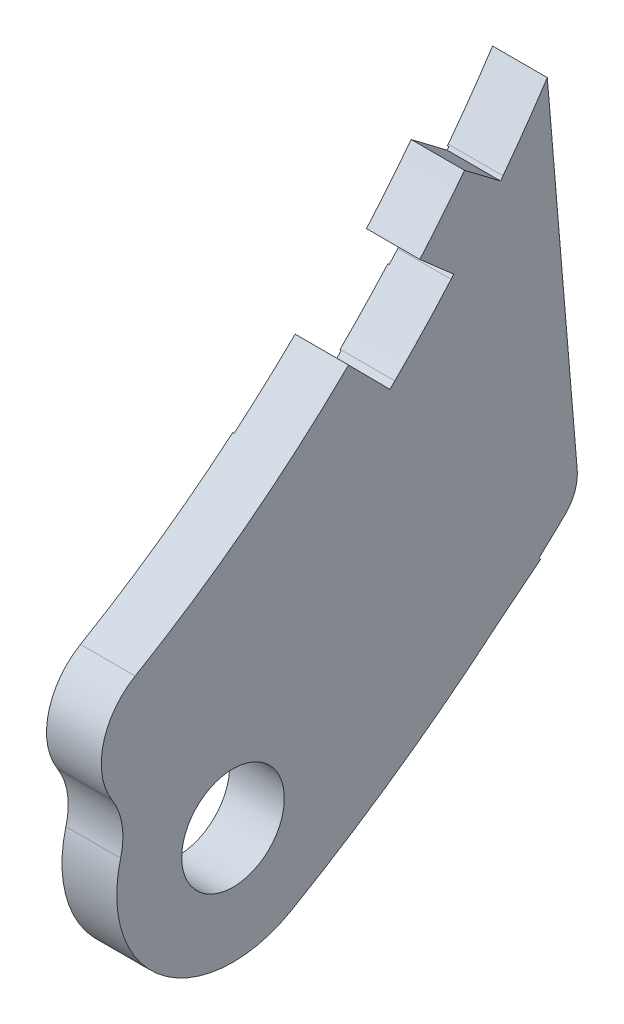
ISO-10303-21;
HEADER;
FILE_DESCRIPTION(('STEP AP214'),'2;1');
FILE_NAME('part.step','',(''),(''),'','','');
FILE_SCHEMA(('AUTOMOTIVE_DESIGN { 1 0 10303 214 1 1 1 1 }'));
ENDSEC;
DATA;
#1=APPLICATION_CONTEXT('core data for automotive mechanical design processes');
#2=APPLICATION_PROTOCOL_DEFINITION('international standard','automotive_design',2000,#1);
#3=PRODUCT_CONTEXT('',#1,'mechanical');
#4=PRODUCT('Part','Part','',(#3));
#5=PRODUCT_RELATED_PRODUCT_CATEGORY('part','',(#4));
#6=PRODUCT_DEFINITION_FORMATION('','',#4);
#7=PRODUCT_DEFINITION_CONTEXT('part definition',#1,'design');
#8=PRODUCT_DEFINITION('design','',#6,#7);
#9=PRODUCT_DEFINITION_SHAPE('','',#8);
#10=(LENGTH_UNIT() NAMED_UNIT(*) SI_UNIT(.MILLI.,.METRE.));
#11=(NAMED_UNIT(*) PLANE_ANGLE_UNIT() SI_UNIT($,.RADIAN.));
#12=(NAMED_UNIT(*) SI_UNIT($,.STERADIAN.) SOLID_ANGLE_UNIT());
#13=UNCERTAINTY_MEASURE_WITH_UNIT(LENGTH_MEASURE(1.E-05),#10,'distance_accuracy_value','');
#14=(GEOMETRIC_REPRESENTATION_CONTEXT(3) GLOBAL_UNCERTAINTY_ASSIGNED_CONTEXT((#13)) GLOBAL_UNIT_ASSIGNED_CONTEXT((#10,
#11,#12)) REPRESENTATION_CONTEXT('',''));
#15=CARTESIAN_POINT('',(0.,0.,0.));
#16=DIRECTION('',(0.,0.,1.));
#17=DIRECTION('',(1.,0.,0.));
#18=AXIS2_PLACEMENT_3D('',#15,#16,#17);
#19=CARTESIAN_POINT('',(262.8,0.,0.));
#20=DIRECTION('',(1.,0.,0.));
#21=DIRECTION('',(0.,0.,-1.));
#22=AXIS2_PLACEMENT_3D('',#19,#20,#21);
#23=PLANE('',#22);
#24=CARTESIAN_POINT('',(262.8,0.,0.));
#25=DIRECTION('',(-1.,0.,0.));
#26=DIRECTION('',(0.,0.,1.));
#27=AXIS2_PLACEMENT_3D('',#24,#25,#26);
#28=CIRCLE('',#27,84.3);
#29=CARTESIAN_POINT('',(262.8,-46.2639612951835,-70.4708158408696));
#30=VERTEX_POINT('',#29);
#31=CARTESIAN_POINT('',(262.8,-50.8569549756148,-67.2313924488277));
#32=VERTEX_POINT('',#31);
#33=EDGE_CURVE('E253',#30,#32,#28,.T.);
#34=ORIENTED_EDGE('',*,*,#33,.F.);
#35=DIRECTION('',(0.,-0.996462965392255,-0.0840330804009582));
#36=VECTOR('',#35,1.);
#37=CARTESIAN_POINT('',(262.8,-45.7781275192469,-70.4298448161826));
#38=LINE('',#37,#36);
#39=CARTESIAN_POINT('',(262.8,-56.1097224032477,-71.3011222983473));
#40=VERTEX_POINT('',#39);
#41=EDGE_CURVE('E251',#30,#40,#38,.T.);
#42=ORIENTED_EDGE('',*,*,#41,.T.);
#43=DIRECTION('',(0.,0.781749432604839,0.623592675247243));
#44=VECTOR('',#43,1.);
#45=CARTESIAN_POINT('',(262.8,12.9395480113802,-16.2213007265503));
#46=LINE('',#45,#44);
#47=CARTESIAN_POINT('',(262.8,-50.934389216024,-67.1728175846962));
#48=VERTEX_POINT('',#47);
#49=EDGE_CURVE('E276',#40,#48,#46,.T.);
#50=ORIENTED_EDGE('',*,*,#49,.T.);
#51=DIRECTION('',(0.,-0.797525414576844,0.603285349651418));
#52=VECTOR('',#51,1.);
#53=CARTESIAN_POINT('',(262.8,-50.8569549756145,-67.2313924488279));
#54=LINE('',#53,#52);
#55=EDGE_CURVE('E241',#32,#48,#54,.T.);
#56=ORIENTED_EDGE('',*,*,#55,.F.);
#57=EDGE_LOOP('',(#34,#42,#50,#56));
#58=FACE_BOUND('',#57,.T.);
#59=ADVANCED_FACE('F36',(#58),#23,.F.);
#60=CARTESIAN_POINT('',(262.6,-44.4850390372409,-62.0282439350642));
#61=DIRECTION('',(0.,-0.623592675247242,0.781749432604839));
#62=DIRECTION('',(0.,-0.781749432604839,-0.623592675247243));
#63=AXIS2_PLACEMENT_3D('',#60,#61,#62);
#64=PLANE('',#63);
#65=DIRECTION('',(-1.,0.,0.));
#66=VECTOR('',#65,1.);
#67=CARTESIAN_POINT('',(262.6,-50.934389216024,-67.1728175846962));
#68=LINE('',#67,#66);
#69=CARTESIAN_POINT('',(262.9,-50.934389216024,-67.1728175846962));
#70=VERTEX_POINT('',#69);
#71=EDGE_CURVE('E456',#70,#48,#68,.T.);
#72=ORIENTED_EDGE('',*,*,#71,.T.);
#73=ORIENTED_EDGE('',*,*,#49,.F.);
#74=DIRECTION('',(-1.,0.,0.));
#75=VECTOR('',#74,1.);
#76=CARTESIAN_POINT('',(266.8,-56.1097224032477,-71.3011222983473));
#77=LINE('',#76,#75);
#78=CARTESIAN_POINT('',(262.9,-56.1097224032477,-71.3011222983473));
#79=VERTEX_POINT('',#78);
#80=EDGE_CURVE('E292',#79,#40,#77,.T.);
#81=ORIENTED_EDGE('',*,*,#80,.F.);
#82=DIRECTION('',(0.,-0.781749432604839,-0.623592675247243));
#83=VECTOR('',#82,1.);
#84=CARTESIAN_POINT('',(262.9,-44.4850390372409,-62.0282439350642));
#85=LINE('',#84,#83);
#86=EDGE_CURVE('E289',#70,#79,#85,.T.);
#87=ORIENTED_EDGE('',*,*,#86,.F.);
#88=EDGE_LOOP('',(#72,#73,#81,#87));
#89=FACE_BOUND('',#88,.T.);
#90=ADVANCED_FACE('F502',(#89),#64,.T.);
#91=CARTESIAN_POINT('',(262.9,-44.4850390372409,-62.0282439350642));
#92=DIRECTION('',(-1.,0.,0.));
#93=DIRECTION('',(0.,0.,-1.));
#94=AXIS2_PLACEMENT_3D('',#91,#92,#93);
#95=PLANE('',#94);
#96=CARTESIAN_POINT('',(262.9,0.,0.));
#97=DIRECTION('',(1.,0.,0.));
#98=DIRECTION('',(0.,0.,-1.));
#99=AXIS2_PLACEMENT_3D('',#96,#97,#98);
#100=CIRCLE('',#99,81.);
#101=CARTESIAN_POINT('',(262.9,-53.1149222124121,-61.1539454031333));
#102=VERTEX_POINT('',#101);
#103=CARTESIAN_POINT('',(262.9,-49.1050357864609,-64.4181299046347));
#104=VERTEX_POINT('',#103);
#105=EDGE_CURVE('E444',#102,#104,#100,.T.);
#106=ORIENTED_EDGE('',*,*,#105,.T.);
#107=DIRECTION('',(0.,0.603285349651418,0.797525414576844));
#108=VECTOR('',#107,1.);
#109=CARTESIAN_POINT('',(262.9,-46.2737143865008,-60.6752066352263));
#110=LINE('',#109,#108);
#111=CARTESIAN_POINT('',(262.9,-51.0962125999876,-67.0504068439325));
#112=VERTEX_POINT('',#111);
#113=EDGE_CURVE('E293',#112,#104,#110,.T.);
#114=ORIENTED_EDGE('',*,*,#113,.F.);
#115=DIRECTION('',(0.,0.797525414576844,-0.603285349651418));
#116=VECTOR('',#115,1.);
#117=CARTESIAN_POINT('',(262.9,-49.3075372507277,-68.4034441437704));
#118=LINE('',#117,#116);
#119=EDGE_CURVE('E229',#112,#70,#118,.T.);
#120=ORIENTED_EDGE('',*,*,#119,.T.);
#121=ORIENTED_EDGE('',*,*,#86,.T.);
#122=DIRECTION('',(0.,0.996462965392255,0.0840330804009583));
#123=VECTOR('',#122,1.);
#124=CARTESIAN_POINT('',(262.9,-45.7781275192469,-70.4298448161826));
#125=LINE('',#124,#123);
#126=CARTESIAN_POINT('',(262.9,-68.1240676075324,-72.314308409202));
#127=VERTEX_POINT('',#126);
#128=EDGE_CURVE('E295',#127,#79,#125,.T.);
#129=ORIENTED_EDGE('',*,*,#128,.F.);
#130=DIRECTION('',(0.,-0.781749432604839,-0.623592675247243));
#131=VECTOR('',#130,1.);
#132=CARTESIAN_POINT('',(262.9,-48.6631099613974,-56.7905227366117));
#133=LINE('',#132,#131);
#134=CARTESIAN_POINT('',(262.9,-56.2182557050236,-62.8171769939128));
#135=VERTEX_POINT('',#134);
#136=EDGE_CURVE('E224',#135,#127,#133,.T.);
#137=ORIENTED_EDGE('',*,*,#136,.F.);
#138=CARTESIAN_POINT('',(262.9,0.,0.));
#139=DIRECTION('',(1.,0.,0.));
#140=DIRECTION('',(0.,0.,-1.));
#141=AXIS2_PLACEMENT_3D('',#138,#139,#140);
#142=CIRCLE('',#141,84.3);
#143=CARTESIAN_POINT('',(262.9,-55.5142080574411,-63.4402293797487));
#144=VERTEX_POINT('',#143);
#145=EDGE_CURVE('E207',#135,#144,#142,.T.);
#146=ORIENTED_EDGE('',*,*,#145,.T.);
#147=DIRECTION('',(0.,0.752553136177328,-0.6585315309305));
#148=VECTOR('',#147,1.);
#149=CARTESIAN_POINT('',(262.9,-49.9677418369718,-68.2937376781439));
#150=LINE('',#149,#148);
#151=CARTESIAN_POINT('',(262.9,-55.2884421165879,-63.6377888390279));
#152=VERTEX_POINT('',#151);
#153=EDGE_CURVE('E209',#144,#152,#150,.T.);
#154=ORIENTED_EDGE('',*,*,#153,.T.);
#155=DIRECTION('',(0.,0.6585315309305,0.752553136177328));
#156=VECTOR('',#155,1.);
#157=CARTESIAN_POINT('',(262.9,-49.805739316857,-57.3722950959482));
#158=LINE('',#157,#156);
#159=EDGE_CURVE('E44',#152,#102,#158,.T.);
#160=ORIENTED_EDGE('',*,*,#159,.T.);
#161=EDGE_LOOP('',(#106,#114,#120,#121,#129,#137,#146,#154,#160));
#162=FACE_BOUND('',#161,.T.);
#163=ADVANCED_FACE('F221',(#162),#95,.T.);
#164=CARTESIAN_POINT('',(262.9,-48.6631099613974,-56.7905227366117));
#165=DIRECTION('',(0.,0.623592675247242,-0.781749432604839));
#166=DIRECTION('',(0.,0.781749432604839,0.623592675247243));
#167=AXIS2_PLACEMENT_3D('',#164,#165,#166);
#168=PLANE('',#167);
#169=DIRECTION('',(-1.,0.,0.));
#170=VECTOR('',#169,1.);
#171=CARTESIAN_POINT('',(333.198032184288,-56.2182557050236,-62.8171769939128));
#172=LINE('',#171,#170);
#173=CARTESIAN_POINT('',(262.8,-56.2182557050236,-62.8171769939128));
#174=VERTEX_POINT('',#173);
#175=EDGE_CURVE('E226',#174,#135,#172,.F.);
#176=ORIENTED_EDGE('',*,*,#175,.T.);
#177=ORIENTED_EDGE('',*,*,#136,.T.);
#178=DIRECTION('',(1.,0.,0.));
#179=VECTOR('',#178,1.);
#180=CARTESIAN_POINT('',(266.8,-68.1240676075324,-72.314308409202));
#181=LINE('',#180,#179);
#182=CARTESIAN_POINT('',(262.8,-68.1240676075324,-72.3143084092021));
#183=VERTEX_POINT('',#182);
#184=EDGE_CURVE('E260',#183,#127,#181,.T.);
#185=ORIENTED_EDGE('',*,*,#184,.F.);
#186=DIRECTION('',(0.,-0.781749432604839,-0.623592675247243));
#187=VECTOR('',#186,1.);
#188=CARTESIAN_POINT('',(262.8,8.76147708722366,-10.9835795280979));
#189=LINE('',#188,#187);
#190=EDGE_CURVE('E297',#174,#183,#189,.T.);
#191=ORIENTED_EDGE('',*,*,#190,.F.);
#192=EDGE_LOOP('',(#176,#177,#185,#191));
#193=FACE_BOUND('',#192,.T.);
#194=ADVANCED_FACE('F544',(#193),#168,.T.);
#195=CARTESIAN_POINT('',(262.8,-82.272413359522,-47.4999999999995));
#196=DIRECTION('',(-1.,0.,0.));
#197=DIRECTION('',(0.,0.,1.));
#198=AXIS2_PLACEMENT_3D('',#195,#196,#197);
#199=CIRCLE('',#198,3.75000000000001);
#200=CARTESIAN_POINT('',(262.8,-82.272413359522,-43.7499999999995));
#201=VERTEX_POINT('',#200);
#202=EDGE_CURVE('E308',#201,#201,#199,.T.);
#203=ORIENTED_EDGE('',*,*,#202,.F.);
#204=EDGE_LOOP('',(#203));
#205=FACE_BOUND('',#204,.T.);
#206=DIRECTION('',(0.,-0.781749432604839,-0.623592675247243));
#207=VECTOR('',#206,1.);
#208=CARTESIAN_POINT('',(262.8,1.28558516326388,-1.61163771134459));
#209=LINE('',#208,#207);
#210=CARTESIAN_POINT('',(262.8,-61.2336002625435,-51.4824843892272));
#211=VERTEX_POINT('',#210);
#212=CARTESIAN_POINT('',(262.8,-79.5914848635024,-66.1263611772757));
#213=VERTEX_POINT('',#212);
#214=EDGE_CURVE('E270',#211,#213,#209,.T.);
#215=ORIENTED_EDGE('',*,*,#214,.T.);
#216=DIRECTION('',(0.,-0.623592675247242,0.781749432604839));
#217=VECTOR('',#216,1.);
#218=CARTESIAN_POINT('',(262.8,-80.8770700267663,-64.5147234659311));
#219=LINE('',#218,#217);
#220=CARTESIAN_POINT('',(262.8,-79.006292001024,-66.8599717637463));
#221=VERTEX_POINT('',#220);
#222=EDGE_CURVE('E252',#221,#213,#219,.T.);
#223=ORIENTED_EDGE('',*,*,#222,.F.);
#224=CARTESIAN_POINT('',(262.8,0.,0.));
#225=DIRECTION('',(-1.,0.,0.));
#226=DIRECTION('',(0.,0.,-1.));
#227=AXIS2_PLACEMENT_3D('',#224,#225,#226);
#228=CIRCLE('',#227,103.5);
#229=CARTESIAN_POINT('',(262.8,-89.6336292916897,-51.7499999999994));
#230=VERTEX_POINT('',#229);
#231=EDGE_CURVE('E306',#221,#230,#228,.T.);
#232=ORIENTED_EDGE('',*,*,#231,.T.);
#233=CARTESIAN_POINT('',(262.8,-82.272413359522,-47.4999999999995));
#234=DIRECTION('',(-1.,0.,0.));
#235=DIRECTION('',(0.,0.,-1.));
#236=AXIS2_PLACEMENT_3D('',#233,#234,#235);
#237=CIRCLE('',#236,8.50000000000001);
#238=CARTESIAN_POINT('',(262.8,-80.0832631244349,-39.2867411310597));
#239=VERTEX_POINT('',#238);
#240=EDGE_CURVE('E343',#230,#239,#237,.T.);
#241=ORIENTED_EDGE('',*,*,#240,.T.);
#242=CARTESIAN_POINT('',(262.8,-78.7955276920308,-34.4554123846245));
#243=DIRECTION('',(1.,0.,0.));
#244=DIRECTION('',(0.,0.,-1.));
#245=AXIS2_PLACEMENT_3D('',#242,#243,#244);
#246=CIRCLE('',#245,5.);
#247=CARTESIAN_POINT('',(262.8,-76.0957327643658,-38.663869031491));
#248=VERTEX_POINT('',#247);
#249=EDGE_CURVE('E339',#239,#248,#246,.T.);
#250=ORIENTED_EDGE('',*,*,#249,.T.);
#251=CARTESIAN_POINT('',(262.8,-73.3959378367008,-42.8723256783574));
#252=DIRECTION('',(-1.,0.,0.));
#253=DIRECTION('',(0.,0.,1.));
#254=AXIS2_PLACEMENT_3D('',#251,#252,#253);
#255=CIRCLE('',#254,5.);
#256=CARTESIAN_POINT('',(262.8,-69.0785297286596,-40.3504241678658));
#257=VERTEX_POINT('',#256);
#258=EDGE_CURVE('E335',#248,#257,#255,.T.);
#259=ORIENTED_EDGE('',*,*,#258,.T.);
#260=CARTESIAN_POINT('',(262.8,0.,0.));
#261=DIRECTION('',(1.,0.,0.));
#262=DIRECTION('',(0.,0.,-1.));
#263=AXIS2_PLACEMENT_3D('',#260,#261,#262);
#264=CIRCLE('',#263,80.);
#265=EDGE_CURVE('E281',#257,#211,#264,.T.);
#266=ORIENTED_EDGE('',*,*,#265,.T.);
#267=EDGE_LOOP('',(#215,#223,#232,#241,#250,#259,#266));
#268=FACE_BOUND('',#267,.T.);
#269=ADVANCED_FACE('F415',(#205,#268),#23,.F.);
#270=CARTESIAN_POINT('',(266.8,-82.272413359522,-47.4999999999995));
#271=DIRECTION('',(-1.,0.,0.));
#272=DIRECTION('',(0.,0.,-1.));
#273=AXIS2_PLACEMENT_3D('',#270,#271,#272);
#274=CYLINDRICAL_SURFACE('',#273,3.75000000000001);
#275=CARTESIAN_POINT('',(266.8,-82.272413359522,-47.4999999999995));
#276=DIRECTION('',(-1.,0.,0.));
#277=DIRECTION('',(0.,0.,1.));
#278=AXIS2_PLACEMENT_3D('',#275,#276,#277);
#279=CIRCLE('',#278,3.75000000000001);
#280=CARTESIAN_POINT('',(266.8,-82.272413359522,-43.7499999999995));
#281=VERTEX_POINT('',#280);
#282=EDGE_CURVE('E303',#281,#281,#279,.T.);
#283=ORIENTED_EDGE('',*,*,#282,.F.);
#284=EDGE_LOOP('',(#283));
#285=FACE_BOUND('',#284,.T.);
#286=ORIENTED_EDGE('',*,*,#202,.T.);
#287=EDGE_LOOP('',(#286));
#288=FACE_BOUND('',#287,.T.);
#289=ADVANCED_FACE('F543',(#285,#288),#274,.F.);
#290=CARTESIAN_POINT('',(266.8,-73.3959378367008,-42.8723256783574));
#291=DIRECTION('',(-1.,0.,0.));
#292=DIRECTION('',(0.,0.,-1.));
#293=AXIS2_PLACEMENT_3D('',#290,#291,#292);
#294=CYLINDRICAL_SURFACE('',#293,5.);
#295=ORIENTED_EDGE('',*,*,#258,.F.);
#296=DIRECTION('',(-1.,0.,0.));
#297=VECTOR('',#296,1.);
#298=CARTESIAN_POINT('',(266.8,-76.0957327643658,-38.663869031491));
#299=LINE('',#298,#297);
#300=CARTESIAN_POINT('',(266.8,-76.0957327643658,-38.663869031491));
#301=VERTEX_POINT('',#300);
#302=EDGE_CURVE('E338',#301,#248,#299,.T.);
#303=ORIENTED_EDGE('',*,*,#302,.F.);
#304=CARTESIAN_POINT('',(266.8,-73.3959378367008,-42.8723256783574));
#305=DIRECTION('',(-1.,0.,0.));
#306=DIRECTION('',(0.,0.,1.));
#307=AXIS2_PLACEMENT_3D('',#304,#305,#306);
#308=CIRCLE('',#307,5.);
#309=CARTESIAN_POINT('',(266.8,-69.0785297286596,-40.3504241678658));
#310=VERTEX_POINT('',#309);
#311=EDGE_CURVE('E319',#301,#310,#308,.T.);
#312=ORIENTED_EDGE('',*,*,#311,.T.);
#313=DIRECTION('',(-1.,0.,0.));
#314=VECTOR('',#313,1.);
#315=CARTESIAN_POINT('',(266.8,-69.0785297286596,-40.3504241678658));
#316=LINE('',#315,#314);
#317=EDGE_CURVE('E334',#310,#257,#316,.T.);
#318=ORIENTED_EDGE('',*,*,#317,.T.);
#319=EDGE_LOOP('',(#295,#303,#312,#318));
#320=FACE_BOUND('',#319,.T.);
#321=ADVANCED_FACE('F571',(#320),#294,.T.);
#322=CARTESIAN_POINT('',(266.8,-78.7955276920308,-34.4554123846245));
#323=DIRECTION('',(-1.,0.,0.));
#324=DIRECTION('',(0.,0.,-1.));
#325=AXIS2_PLACEMENT_3D('',#322,#323,#324);
#326=CYLINDRICAL_SURFACE('',#325,5.);
#327=ORIENTED_EDGE('',*,*,#249,.F.);
#328=DIRECTION('',(-1.,0.,0.));
#329=VECTOR('',#328,1.);
#330=CARTESIAN_POINT('',(266.8,-80.0832631244349,-39.2867411310597));
#331=LINE('',#330,#329);
#332=CARTESIAN_POINT('',(266.8,-80.0832631244349,-39.2867411310597));
#333=VERTEX_POINT('',#332);
#334=EDGE_CURVE('E342',#333,#239,#331,.T.);
#335=ORIENTED_EDGE('',*,*,#334,.F.);
#336=CARTESIAN_POINT('',(266.8,-78.7955276920308,-34.4554123846245));
#337=DIRECTION('',(1.,0.,0.));
#338=DIRECTION('',(0.,0.,-1.));
#339=AXIS2_PLACEMENT_3D('',#336,#337,#338);
#340=CIRCLE('',#339,5.);
#341=EDGE_CURVE('E322',#333,#301,#340,.T.);
#342=ORIENTED_EDGE('',*,*,#341,.T.);
#343=ORIENTED_EDGE('',*,*,#302,.T.);
#344=EDGE_LOOP('',(#327,#335,#342,#343));
#345=FACE_BOUND('',#344,.T.);
#346=ADVANCED_FACE('F574',(#345),#326,.F.);
#347=CARTESIAN_POINT('',(266.8,-82.272413359522,-47.4999999999995));
#348=DIRECTION('',(-1.,0.,0.));
#349=DIRECTION('',(0.,0.,-1.));
#350=AXIS2_PLACEMENT_3D('',#347,#348,#349);
#351=CYLINDRICAL_SURFACE('',#350,8.50000000000001);
#352=ORIENTED_EDGE('',*,*,#240,.F.);
#353=DIRECTION('',(-1.,0.,0.));
#354=VECTOR('',#353,1.);
#355=CARTESIAN_POINT('',(266.8,-89.6336292916897,-51.7499999999994));
#356=LINE('',#355,#354);
#357=CARTESIAN_POINT('',(266.8,-89.6336292916897,-51.7499999999994));
#358=VERTEX_POINT('',#357);
#359=EDGE_CURVE('E346',#358,#230,#356,.T.);
#360=ORIENTED_EDGE('',*,*,#359,.F.);
#361=CARTESIAN_POINT('',(266.8,-82.272413359522,-47.4999999999995));
#362=DIRECTION('',(-1.,0.,0.));
#363=DIRECTION('',(0.,0.,-1.));
#364=AXIS2_PLACEMENT_3D('',#361,#362,#363);
#365=CIRCLE('',#364,8.50000000000001);
#366=EDGE_CURVE('E324',#358,#333,#365,.T.);
#367=ORIENTED_EDGE('',*,*,#366,.T.);
#368=ORIENTED_EDGE('',*,*,#334,.T.);
#369=EDGE_LOOP('',(#352,#360,#367,#368));
#370=FACE_BOUND('',#369,.T.);
#371=ADVANCED_FACE('F411',(#370),#351,.T.);
#372=CARTESIAN_POINT('',(266.8,0.,0.));
#373=DIRECTION('',(-1.,0.,0.));
#374=DIRECTION('',(0.,0.,-1.));
#375=AXIS2_PLACEMENT_3D('',#372,#373,#374);
#376=CYLINDRICAL_SURFACE('',#375,103.5);
#377=DIRECTION('',(1.,0.,0.));
#378=VECTOR('',#377,1.);
#379=CARTESIAN_POINT('',(258.7,-79.0062920010245,-66.8599717637455));
#380=LINE('',#379,#378);
#381=CARTESIAN_POINT('',(262.9,-79.0062920010268,-66.8599717637427));
#382=VERTEX_POINT('',#381);
#383=EDGE_CURVE('E259',#221,#382,#380,.T.);
#384=ORIENTED_EDGE('',*,*,#383,.T.);
#385=CARTESIAN_POINT('',(266.8,-79.006292001024,-66.8599717637463));
#386=VERTEX_POINT('',#385);
#387=EDGE_CURVE('E356',#382,#386,#380,.T.);
#388=ORIENTED_EDGE('',*,*,#387,.T.);
#389=CARTESIAN_POINT('',(266.8,0.,0.));
#390=DIRECTION('',(-1.,0.,0.));
#391=DIRECTION('',(0.,0.,-1.));
#392=AXIS2_PLACEMENT_3D('',#389,#390,#391);
#393=CIRCLE('',#392,103.5);
#394=EDGE_CURVE('E284',#386,#358,#393,.T.);
#395=ORIENTED_EDGE('',*,*,#394,.T.);
#396=ORIENTED_EDGE('',*,*,#359,.T.);
#397=ORIENTED_EDGE('',*,*,#231,.F.);
#398=EDGE_LOOP('',(#384,#388,#395,#396,#397));
#399=FACE_BOUND('',#398,.T.);
#400=ADVANCED_FACE('F387',(#399),#376,.T.);
#401=CARTESIAN_POINT('',(266.8,-72.43436866769,-69.6671532051739));
#402=DIRECTION('',(-1.,0.,0.));
#403=DIRECTION('',(0.,0.,-1.));
#404=AXIS2_PLACEMENT_3D('',#401,#402,#403);
#405=CYLINDRICAL_SURFACE('',#404,3.);
#406=CARTESIAN_POINT('',(266.8,-72.43436866769,-69.6671532051739));
#407=DIRECTION('',(-1.,0.,0.));
#408=DIRECTION('',(0.,0.,1.));
#409=AXIS2_PLACEMENT_3D('',#406,#407,#408);
#410=CIRCLE('',#409,3.);
#411=CARTESIAN_POINT('',(266.8,-72.1822694264871,-72.6565421013506));
#412=VERTEX_POINT('',#411);
#413=CARTESIAN_POINT('',(266.8,-74.5965886279196,-71.7467697187612));
#414=VERTEX_POINT('',#413);
#415=EDGE_CURVE('E314',#412,#414,#410,.T.);
#416=ORIENTED_EDGE('',*,*,#415,.T.);
#417=DIRECTION('',(-1.,0.,0.));
#418=VECTOR('',#417,1.);
#419=CARTESIAN_POINT('',(266.8,-74.5965886279196,-71.7467697187611));
#420=LINE('',#419,#418);
#421=CARTESIAN_POINT('',(262.8,-74.5965886279196,-71.7467697187612));
#422=VERTEX_POINT('',#421);
#423=EDGE_CURVE('E328',#414,#422,#420,.T.);
#424=ORIENTED_EDGE('',*,*,#423,.T.);
#425=CARTESIAN_POINT('',(262.8,-72.43436866769,-69.6671532051739));
#426=DIRECTION('',(-1.,0.,0.));
#427=DIRECTION('',(0.,0.,1.));
#428=AXIS2_PLACEMENT_3D('',#425,#426,#427);
#429=CIRCLE('',#428,3.);
#430=CARTESIAN_POINT('',(262.8,-72.1822694264871,-72.6565421013506));
#431=VERTEX_POINT('',#430);
#432=EDGE_CURVE('E311',#422,#431,#429,.F.);
#433=ORIENTED_EDGE('',*,*,#432,.T.);
#434=DIRECTION('',(-1.,0.,0.));
#435=VECTOR('',#434,1.);
#436=CARTESIAN_POINT('',(266.8,-72.1822694264871,-72.6565421013506));
#437=LINE('',#436,#435);
#438=EDGE_CURVE('E357',#431,#412,#437,.F.);
#439=ORIENTED_EDGE('',*,*,#438,.T.);
#440=EDGE_LOOP('',(#416,#424,#433,#439));
#441=FACE_BOUND('',#440,.T.);
#442=ADVANCED_FACE('F484',(#441),#405,.T.);
#443=CARTESIAN_POINT('',(266.8,-45.7781275192469,-70.4298448161826));
#444=DIRECTION('',(0.,-0.0840330804009581,0.996462965392255));
#445=DIRECTION('',(0.,-0.996462965392255,-0.0840330804009583));
#446=AXIS2_PLACEMENT_3D('',#443,#444,#445);
#447=PLANE('',#446);
#448=DIRECTION('',(0.,-0.996462965392255,-0.0840330804009582));
#449=VECTOR('',#448,1.);
#450=CARTESIAN_POINT('',(266.8,-45.7781275192469,-70.4298448161826));
#451=LINE('',#450,#449);
#452=CARTESIAN_POINT('',(266.8,-46.2639612951835,-70.4708158408696));
#453=VERTEX_POINT('',#452);
#454=EDGE_CURVE('E315',#453,#412,#451,.T.);
#455=ORIENTED_EDGE('',*,*,#454,.T.);
#456=ORIENTED_EDGE('',*,*,#438,.F.);
#457=EDGE_CURVE('E331',#183,#431,#38,.T.);
#458=ORIENTED_EDGE('',*,*,#457,.F.);
#459=ORIENTED_EDGE('',*,*,#184,.T.);
#460=ORIENTED_EDGE('',*,*,#128,.T.);
#461=ORIENTED_EDGE('',*,*,#80,.T.);
#462=ORIENTED_EDGE('',*,*,#41,.F.);
#463=DIRECTION('',(-1.,0.,0.));
#464=VECTOR('',#463,1.);
#465=CARTESIAN_POINT('',(333.198032184288,-46.2639612951835,-70.4708158408696));
#466=LINE('',#465,#464);
#467=EDGE_CURVE('E249',#453,#30,#466,.T.);
#468=ORIENTED_EDGE('',*,*,#467,.F.);
#469=EDGE_LOOP('',(#455,#456,#458,#459,#460,#461,#462,#468));
#470=FACE_BOUND('',#469,.T.);
#471=ADVANCED_FACE('F487',(#470),#447,.F.);
#472=CARTESIAN_POINT('',(333.198032184288,0.,0.));
#473=DIRECTION('',(-1.,0.,0.));
#474=DIRECTION('',(0.,0.,-1.));
#475=AXIS2_PLACEMENT_3D('',#472,#473,#474);
#476=CYLINDRICAL_SURFACE('',#475,84.3);
#477=ORIENTED_EDGE('',*,*,#467,.T.);
#478=ORIENTED_EDGE('',*,*,#33,.T.);
#479=DIRECTION('',(-1.,0.,0.));
#480=VECTOR('',#479,1.);
#481=CARTESIAN_POINT('',(333.198032184288,-50.8569549756148,-67.2313924488277));
#482=LINE('',#481,#480);
#483=CARTESIAN_POINT('',(266.8,-50.8569549756145,-67.2313924488279));
#484=VERTEX_POINT('',#483);
#485=EDGE_CURVE('E247',#484,#32,#482,.T.);
#486=ORIENTED_EDGE('',*,*,#485,.F.);
#487=CARTESIAN_POINT('',(266.8,0.,0.));
#488=DIRECTION('',(-1.,0.,0.));
#489=DIRECTION('',(0.,0.,1.));
#490=AXIS2_PLACEMENT_3D('',#487,#488,#489);
#491=CIRCLE('',#490,84.3);
#492=EDGE_CURVE('E244',#453,#484,#491,.T.);
#493=ORIENTED_EDGE('',*,*,#492,.F.);
#494=EDGE_LOOP('',(#477,#478,#486,#493));
#495=FACE_BOUND('',#494,.T.);
#496=ADVANCED_FACE('F492',(#495),#476,.F.);
#497=CARTESIAN_POINT('',(262.7,-51.0962125999876,-67.0504068439325));
#498=DIRECTION('',(0.,-0.603285349651418,-0.797525414576844));
#499=DIRECTION('',(0.,0.797525414576844,-0.603285349651418));
#500=AXIS2_PLACEMENT_3D('',#497,#498,#499);
#501=PLANE('',#500);
#502=DIRECTION('',(0.,-0.797525414576844,0.603285349651418));
#503=VECTOR('',#502,1.);
#504=CARTESIAN_POINT('',(266.8,-50.8569549756145,-67.2313924488279));
#505=LINE('',#504,#503);
#506=CARTESIAN_POINT('',(266.8,-51.0962125999876,-67.0504068439325));
#507=VERTEX_POINT('',#506);
#508=EDGE_CURVE('E225',#484,#507,#505,.T.);
#509=ORIENTED_EDGE('',*,*,#508,.F.);
#510=ORIENTED_EDGE('',*,*,#485,.T.);
#511=ORIENTED_EDGE('',*,*,#55,.T.);
#512=ORIENTED_EDGE('',*,*,#71,.F.);
#513=ORIENTED_EDGE('',*,*,#119,.F.);
#514=DIRECTION('',(1.,0.,0.));
#515=VECTOR('',#514,1.);
#516=CARTESIAN_POINT('',(262.7,-51.0962125999876,-67.0504068439325));
#517=LINE('',#516,#515);
#518=EDGE_CURVE('E451',#112,#507,#517,.T.);
#519=ORIENTED_EDGE('',*,*,#518,.T.);
#520=EDGE_LOOP('',(#509,#510,#511,#512,#513,#519));
#521=FACE_BOUND('',#520,.T.);
#522=ADVANCED_FACE('F496',(#521),#501,.F.);
#523=CARTESIAN_POINT('',(0.,-0.239257624373074,0.180985604895448));
#524=DIRECTION('',(0.,0.797525414576844,-0.603285349651418));
#525=DIRECTION('',(0.,0.603285349651418,0.797525414576844));
#526=AXIS2_PLACEMENT_3D('',#523,#524,#525);
#527=PLANE('',#526);
#528=DIRECTION('',(1.,0.,0.));
#529=VECTOR('',#528,1.);
#530=CARTESIAN_POINT('',(258.7,-49.1050357864609,-64.4181299046347));
#531=LINE('',#530,#529);
#532=CARTESIAN_POINT('',(266.8,-49.1050357864609,-64.4181299046347));
#533=VERTEX_POINT('',#532);
#534=EDGE_CURVE('E511',#104,#533,#531,.T.);
#535=ORIENTED_EDGE('',*,*,#534,.T.);
#536=DIRECTION('',(0.,-0.603285349651418,-0.797525414576844));
#537=VECTOR('',#536,1.);
#538=CARTESIAN_POINT('',(266.8,-0.239257624373074,0.180985604895448));
#539=LINE('',#538,#537);
#540=EDGE_CURVE('E280',#533,#507,#539,.T.);
#541=ORIENTED_EDGE('',*,*,#540,.T.);
#542=ORIENTED_EDGE('',*,*,#518,.F.);
#543=ORIENTED_EDGE('',*,*,#113,.T.);
#544=EDGE_LOOP('',(#535,#541,#542,#543));
#545=FACE_BOUND('',#544,.T.);
#546=ADVANCED_FACE('F510',(#545),#527,.T.);
#547=CARTESIAN_POINT('',(0.,0.225765940853218,-0.197559459279177));
#548=DIRECTION('',(0.,0.752553136177328,-0.6585315309305));
#549=DIRECTION('',(0.,0.6585315309305,0.752553136177328));
#550=AXIS2_PLACEMENT_3D('',#547,#548,#549);
#551=PLANE('',#550);
#552=ORIENTED_EDGE('',*,*,#159,.F.);
#553=DIRECTION('',(-1.,0.,0.));
#554=VECTOR('',#553,1.);
#555=CARTESIAN_POINT('',(262.7,-55.2884421165879,-63.6377888390279));
#556=LINE('',#555,#554);
#557=CARTESIAN_POINT('',(266.8,-55.2884421165879,-63.6377888390279));
#558=VERTEX_POINT('',#557);
#559=EDGE_CURVE('E214',#558,#152,#556,.T.);
#560=ORIENTED_EDGE('',*,*,#559,.F.);
#561=DIRECTION('',(0.,-0.6585315309305,-0.752553136177328));
#562=VECTOR('',#561,1.);
#563=CARTESIAN_POINT('',(266.8,0.225765940853231,-0.19755945927917));
#564=LINE('',#563,#562);
#565=CARTESIAN_POINT('',(266.8,-53.1149222124121,-61.1539454031333));
#566=VERTEX_POINT('',#565);
#567=EDGE_CURVE('E218',#566,#558,#564,.T.);
#568=ORIENTED_EDGE('',*,*,#567,.F.);
#569=DIRECTION('',(1.,0.,0.));
#570=VECTOR('',#569,1.);
#571=CARTESIAN_POINT('',(258.7,-53.1149222124121,-61.1539454031333));
#572=LINE('',#571,#570);
#573=EDGE_CURVE('E524',#102,#566,#572,.T.);
#574=ORIENTED_EDGE('',*,*,#573,.F.);
#575=EDGE_LOOP('',(#552,#560,#568,#574));
#576=FACE_BOUND('',#575,.T.);
#577=ADVANCED_FACE('F523',(#576),#551,.F.);
#578=CARTESIAN_POINT('',(262.7,-55.2884421165879,-63.6377888390279));
#579=DIRECTION('',(0.,-0.6585315309305,-0.752553136177328));
#580=DIRECTION('',(0.,0.752553136177328,-0.6585315309305));
#581=AXIS2_PLACEMENT_3D('',#578,#579,#580);
#582=PLANE('',#581);
#583=DIRECTION('',(0.,-0.752553136177328,0.6585315309305));
#584=VECTOR('',#583,1.);
#585=CARTESIAN_POINT('',(266.8,-55.5142080574411,-63.4402293797487));
#586=LINE('',#585,#584);
#587=CARTESIAN_POINT('',(266.8,-55.5142080574395,-63.4402293797502));
#588=VERTEX_POINT('',#587);
#589=EDGE_CURVE('E58',#558,#588,#586,.T.);
#590=ORIENTED_EDGE('',*,*,#589,.F.);
#591=ORIENTED_EDGE('',*,*,#559,.T.);
#592=ORIENTED_EDGE('',*,*,#153,.F.);
#593=DIRECTION('',(-1.,0.,0.));
#594=VECTOR('',#593,1.);
#595=CARTESIAN_POINT('',(333.198032184288,-55.5142080574395,-63.4402293797502));
#596=LINE('',#595,#594);
#597=EDGE_CURVE('E202',#588,#144,#596,.T.);
#598=ORIENTED_EDGE('',*,*,#597,.F.);
#599=EDGE_LOOP('',(#590,#591,#592,#598));
#600=FACE_BOUND('',#599,.T.);
#601=ADVANCED_FACE('F212',(#600),#582,.F.);
#602=DIRECTION('',(-1.,0.,0.));
#603=VECTOR('',#602,1.);
#604=CARTESIAN_POINT('',(266.8,-74.9922497842851,-71.3331092291048));
#605=LINE('',#604,#603);
#606=CARTESIAN_POINT('',(262.9,-74.9922497842851,-71.3331092291048));
#607=VERTEX_POINT('',#606);
#608=CARTESIAN_POINT('',(262.8,-74.9922497842851,-71.3331092291048));
#609=VERTEX_POINT('',#608);
#610=EDGE_CURVE('E269',#607,#609,#605,.T.);
#611=ORIENTED_EDGE('',*,*,#610,.T.);
#612=EDGE_CURVE('E300',#422,#609,#228,.T.);
#613=ORIENTED_EDGE('',*,*,#612,.F.);
#614=ORIENTED_EDGE('',*,*,#423,.F.);
#615=CARTESIAN_POINT('',(266.8,-76.3606536483423,-69.8663050003212));
#616=VERTEX_POINT('',#615);
#617=EDGE_CURVE('E288',#414,#616,#393,.T.);
#618=ORIENTED_EDGE('',*,*,#617,.T.);
#619=DIRECTION('',(-1.,0.,0.));
#620=VECTOR('',#619,1.);
#621=CARTESIAN_POINT('',(266.8,-76.3606536483423,-69.8663050003212));
#622=LINE('',#621,#620);
#623=CARTESIAN_POINT('',(262.9,-76.3606536483423,-69.8663050003212));
#624=VERTEX_POINT('',#623);
#625=EDGE_CURVE('E353',#616,#624,#622,.T.);
#626=ORIENTED_EDGE('',*,*,#625,.T.);
#627=CARTESIAN_POINT('',(262.9,0.,0.));
#628=DIRECTION('',(-1.,0.,0.));
#629=DIRECTION('',(0.,0.,1.));
#630=AXIS2_PLACEMENT_3D('',#627,#628,#629);
#631=CIRCLE('',#630,103.5);
#632=EDGE_CURVE('E348',#607,#624,#631,.T.);
#633=ORIENTED_EDGE('',*,*,#632,.F.);
#634=EDGE_LOOP('',(#611,#613,#614,#618,#626,#633));
#635=FACE_BOUND('',#634,.T.);
#636=ADVANCED_FACE('F476',(#635),#376,.T.);
#637=CARTESIAN_POINT('',(392.796966999625,-61.073396129291,-57.6718326848965));
#638=DIRECTION('',(0.,0.623592675247241,-0.78174943260484));
#639=DIRECTION('',(0.,0.78174943260484,0.623592675247241));
#640=AXIS2_PLACEMENT_3D('',#637,#638,#639);
#641=PLANE('',#640);
#642=DIRECTION('',(0.,0.78174943260484,0.623592675247241));
#643=VECTOR('',#642,1.);
#644=CARTESIAN_POINT('',(262.9,-61.073396129291,-57.6718326848965));
#645=LINE('',#644,#643);
#646=CARTESIAN_POINT('',(262.9,-76.5119213000357,-69.9869694941649));
#647=VERTEX_POINT('',#646);
#648=EDGE_CURVE('E273',#647,#624,#645,.T.);
#649=ORIENTED_EDGE('',*,*,#648,.T.);
#650=ORIENTED_EDGE('',*,*,#625,.F.);
#651=DIRECTION('',(0.,-0.78174943260484,-0.623592675247241));
#652=VECTOR('',#651,1.);
#653=CARTESIAN_POINT('',(266.8,-61.073396129291,-57.6718326848965));
#654=LINE('',#653,#652);
#655=CARTESIAN_POINT('',(266.8,-76.5119213000357,-69.9869694941649));
#656=VERTEX_POINT('',#655);
#657=EDGE_CURVE('E285',#616,#656,#654,.T.);
#658=ORIENTED_EDGE('',*,*,#657,.T.);
#659=DIRECTION('',(-1.,0.,0.));
#660=VECTOR('',#659,1.);
#661=CARTESIAN_POINT('',(392.796966999625,-76.5119213000356,-69.9869694941648));
#662=LINE('',#661,#660);
#663=EDGE_CURVE('E307',#656,#647,#662,.T.);
#664=ORIENTED_EDGE('',*,*,#663,.T.);
#665=EDGE_LOOP('',(#649,#650,#658,#664));
#666=FACE_BOUND('',#665,.T.);
#667=ADVANCED_FACE('F480',(#666),#641,.T.);
#668=CARTESIAN_POINT('',(392.796966999625,-76.5119213000356,-69.9869694941648));
#669=DIRECTION('',(0.,-0.781749432604839,-0.623592675247242));
#670=DIRECTION('',(0.,0.623592675247242,-0.781749432604839));
#671=AXIS2_PLACEMENT_3D('',#668,#669,#670);
#672=PLANE('',#671);
#673=DIRECTION('',(0.,-0.623592675247242,0.781749432604839));
#674=VECTOR('',#673,1.);
#675=CARTESIAN_POINT('',(262.9,-79.5914848635024,-66.1263611772757));
#676=LINE('',#675,#674);
#677=EDGE_CURVE('E263',#382,#647,#676,.F.);
#678=ORIENTED_EDGE('',*,*,#677,.T.);
#679=ORIENTED_EDGE('',*,*,#663,.F.);
#680=DIRECTION('',(0.,-0.623592675247242,0.781749432604839));
#681=VECTOR('',#680,1.);
#682=CARTESIAN_POINT('',(266.8,-75.2647359495411,-71.5504683593746));
#683=LINE('',#682,#681);
#684=EDGE_CURVE('E282',#656,#386,#683,.T.);
#685=ORIENTED_EDGE('',*,*,#684,.T.);
#686=ORIENTED_EDGE('',*,*,#387,.F.);
#687=EDGE_LOOP('',(#678,#679,#685,#686));
#688=FACE_BOUND('',#687,.T.);
#689=ADVANCED_FACE('F401',(#688),#672,.T.);
#690=CARTESIAN_POINT('',(0.,-80.8770700267663,-64.5147234659311));
#691=DIRECTION('',(0.,-0.781749432604839,-0.623592675247243));
#692=DIRECTION('',(-1.,0.,0.));
#693=AXIS2_PLACEMENT_3D('',#690,#691,#692);
#694=PLANE('',#693);
#695=CARTESIAN_POINT('',(262.9,-79.5914848635024,-66.1263611772757));
#696=VERTEX_POINT('',#695);
#697=EDGE_CURVE('E261',#696,#382,#676,.F.);
#698=ORIENTED_EDGE('',*,*,#697,.T.);
#699=ORIENTED_EDGE('',*,*,#383,.F.);
#700=ORIENTED_EDGE('',*,*,#222,.T.);
#701=DIRECTION('',(-1.,0.,0.));
#702=VECTOR('',#701,1.);
#703=CARTESIAN_POINT('',(262.9,-79.5914848635024,-66.1263611772757));
#704=LINE('',#703,#702);
#705=EDGE_CURVE('E257',#696,#213,#704,.T.);
#706=ORIENTED_EDGE('',*,*,#705,.F.);
#707=EDGE_LOOP('',(#698,#699,#700,#706));
#708=FACE_BOUND('',#707,.T.);
#709=ADVANCED_FACE('F391',(#708),#694,.F.);
#710=CARTESIAN_POINT('',(262.9,-56.1390018853572,-47.4185809198585));
#711=DIRECTION('',(0.,0.623592675247242,-0.781749432604839));
#712=DIRECTION('',(0.,0.781749432604839,0.623592675247243));
#713=AXIS2_PLACEMENT_3D('',#710,#711,#712);
#714=PLANE('',#713);
#715=ORIENTED_EDGE('',*,*,#214,.F.);
#716=DIRECTION('',(1.,0.,0.));
#717=VECTOR('',#716,1.);
#718=CARTESIAN_POINT('',(258.7,-61.2336002625435,-51.4824843892272));
#719=LINE('',#718,#717);
#720=CARTESIAN_POINT('',(262.9,-61.2336002625435,-51.4824843892272));
#721=VERTEX_POINT('',#720);
#722=EDGE_CURVE('E277',#211,#721,#719,.T.);
#723=ORIENTED_EDGE('',*,*,#722,.T.);
#724=DIRECTION('',(0.,-0.781749432604839,-0.623592675247243));
#725=VECTOR('',#724,1.);
#726=CARTESIAN_POINT('',(262.9,-56.1390018853572,-47.4185809198585));
#727=LINE('',#726,#725);
#728=EDGE_CURVE('E264',#721,#696,#727,.T.);
#729=ORIENTED_EDGE('',*,*,#728,.T.);
#730=ORIENTED_EDGE('',*,*,#705,.T.);
#731=EDGE_LOOP('',(#715,#723,#729,#730));
#732=FACE_BOUND('',#731,.T.);
#733=ADVANCED_FACE('F419',(#732),#714,.T.);
#734=CARTESIAN_POINT('',(333.198032184288,0.,0.));
#735=DIRECTION('',(-1.,0.,0.));
#736=DIRECTION('',(0.,0.,-1.));
#737=AXIS2_PLACEMENT_3D('',#734,#735,#736);
#738=CYLINDRICAL_SURFACE('',#737,84.3);
#739=CARTESIAN_POINT('',(266.8,0.,0.));
#740=DIRECTION('',(-1.,0.,0.));
#741=DIRECTION('',(0.,0.,1.));
#742=AXIS2_PLACEMENT_3D('',#739,#740,#741);
#743=CIRCLE('',#742,84.3);
#744=CARTESIAN_POINT('',(266.8,-59.889746164842,-59.327129580916));
#745=VERTEX_POINT('',#744);
#746=EDGE_CURVE('E200',#588,#745,#743,.T.);
#747=ORIENTED_EDGE('',*,*,#746,.F.);
#748=ORIENTED_EDGE('',*,*,#597,.T.);
#749=ORIENTED_EDGE('',*,*,#145,.F.);
#750=ORIENTED_EDGE('',*,*,#175,.F.);
#751=CARTESIAN_POINT('',(262.8,0.,0.));
#752=DIRECTION('',(-1.,0.,0.));
#753=DIRECTION('',(0.,0.,1.));
#754=AXIS2_PLACEMENT_3D('',#751,#752,#753);
#755=CIRCLE('',#754,84.3);
#756=CARTESIAN_POINT('',(262.8,-59.889746164842,-59.327129580916));
#757=VERTEX_POINT('',#756);
#758=EDGE_CURVE('E237',#174,#757,#755,.T.);
#759=ORIENTED_EDGE('',*,*,#758,.T.);
#760=DIRECTION('',(-1.,0.,0.));
#761=VECTOR('',#760,1.);
#762=CARTESIAN_POINT('',(333.198032184288,-59.889746164842,-59.327129580916));
#763=LINE('',#762,#761);
#764=EDGE_CURVE('E231',#745,#757,#763,.T.);
#765=ORIENTED_EDGE('',*,*,#764,.F.);
#766=EDGE_LOOP('',(#747,#748,#749,#750,#759,#765));
#767=FACE_BOUND('',#766,.T.);
#768=ADVANCED_FACE('F204',(#767),#738,.F.);
#769=ORIENTED_EDGE('',*,*,#758,.F.);
#770=ORIENTED_EDGE('',*,*,#190,.T.);
#771=ORIENTED_EDGE('',*,*,#457,.T.);
#772=ORIENTED_EDGE('',*,*,#432,.F.);
#773=ORIENTED_EDGE('',*,*,#612,.T.);
#774=DIRECTION('',(0.,0.781749432604839,0.623592675247243));
#775=VECTOR('',#774,1.);
#776=CARTESIAN_POINT('',(262.8,5.61233407722511,-7.03574489344344));
#777=LINE('',#776,#775);
#778=CARTESIAN_POINT('',(262.8,-59.9124980517319,-59.3041619312044));
#779=VERTEX_POINT('',#778);
#780=EDGE_CURVE('E248',#609,#779,#777,.T.);
#781=ORIENTED_EDGE('',*,*,#780,.T.);
#782=DIRECTION('',(0.,-0.703761916736869,0.71043589756631));
#783=VECTOR('',#782,1.);
#784=CARTESIAN_POINT('',(262.8,-59.8897461648399,-59.327129580918));
#785=LINE('',#784,#783);
#786=EDGE_CURVE('E240',#757,#779,#785,.T.);
#787=ORIENTED_EDGE('',*,*,#786,.F.);
#788=EDGE_LOOP('',(#769,#770,#771,#772,#773,#781,#787));
#789=FACE_BOUND('',#788,.T.);
#790=ADVANCED_FACE('F468',(#789),#23,.F.);
#791=CARTESIAN_POINT('',(262.6,-51.812252971396,-52.8426881019573));
#792=DIRECTION('',(0.,-0.623592675247242,0.781749432604839));
#793=DIRECTION('',(0.,-0.781749432604839,-0.623592675247243));
#794=AXIS2_PLACEMENT_3D('',#791,#792,#793);
#795=PLANE('',#794);
#796=DIRECTION('',(-1.,0.,0.));
#797=VECTOR('',#796,1.);
#798=CARTESIAN_POINT('',(262.6,-59.9124980517319,-59.3041619312044));
#799=LINE('',#798,#797);
#800=CARTESIAN_POINT('',(262.9,-59.9124980517319,-59.3041619312044));
#801=VERTEX_POINT('',#800);
#802=EDGE_CURVE('E243',#801,#779,#799,.T.);
#803=ORIENTED_EDGE('',*,*,#802,.T.);
#804=ORIENTED_EDGE('',*,*,#780,.F.);
#805=ORIENTED_EDGE('',*,*,#610,.F.);
#806=DIRECTION('',(0.,-0.781749432604839,-0.623592675247243));
#807=VECTOR('',#806,1.);
#808=CARTESIAN_POINT('',(262.9,-51.812252971396,-52.8426881019573));
#809=LINE('',#808,#807);
#810=EDGE_CURVE('E267',#801,#607,#809,.T.);
#811=ORIENTED_EDGE('',*,*,#810,.F.);
#812=EDGE_LOOP('',(#803,#804,#805,#811));
#813=FACE_BOUND('',#812,.T.);
#814=ADVANCED_FACE('F472',(#813),#795,.T.);
#815=CARTESIAN_POINT('',(333.198032184288,-59.8897461648419,-59.327129580916));
#816=DIRECTION('',(0.,-0.71043589756631,-0.703761916736869));
#817=DIRECTION('',(0.,0.703761916736869,-0.71043589756631));
#818=AXIS2_PLACEMENT_3D('',#815,#816,#817);
#819=PLANE('',#818);
#820=DIRECTION('',(0.,-0.703761916736869,0.71043589756631));
#821=VECTOR('',#820,1.);
#822=CARTESIAN_POINT('',(266.8,-59.8897461648399,-59.327129580918));
#823=LINE('',#822,#821);
#824=CARTESIAN_POINT('',(266.8,-60.2446657529211,-58.9688441862047));
#825=VERTEX_POINT('',#824);
#826=EDGE_CURVE('E235',#745,#825,#823,.T.);
#827=ORIENTED_EDGE('',*,*,#826,.F.);
#828=ORIENTED_EDGE('',*,*,#764,.T.);
#829=ORIENTED_EDGE('',*,*,#786,.T.);
#830=ORIENTED_EDGE('',*,*,#802,.F.);
#831=DIRECTION('',(0.,-0.703761916736869,0.71043589756631));
#832=VECTOR('',#831,1.);
#833=CARTESIAN_POINT('',(262.9,-63.9860835196644,-55.1919454565727));
#834=LINE('',#833,#832);
#835=CARTESIAN_POINT('',(262.9,-60.2446657529211,-58.9688441862047));
#836=VERTEX_POINT('',#835);
#837=EDGE_CURVE('E256',#801,#836,#834,.T.);
#838=ORIENTED_EDGE('',*,*,#837,.T.);
#839=DIRECTION('',(1.,0.,0.));
#840=VECTOR('',#839,1.);
#841=CARTESIAN_POINT('',(267.1,-60.2446657529211,-58.9688441862047));
#842=LINE('',#841,#840);
#843=EDGE_CURVE('E441',#836,#825,#842,.T.);
#844=ORIENTED_EDGE('',*,*,#843,.T.);
#845=EDGE_LOOP('',(#827,#828,#829,#830,#838,#844));
#846=FACE_BOUND('',#845,.T.);
#847=ADVANCED_FACE('F38',(#846),#819,.F.);
#848=CARTESIAN_POINT('',(262.9,-56.1390018853572,-47.4185809198585));
#849=DIRECTION('',(1.,0.,0.));
#850=DIRECTION('',(0.,0.,1.));
#851=AXIS2_PLACEMENT_3D('',#848,#849,#850);
#852=PLANE('',#851);
#853=ORIENTED_EDGE('',*,*,#837,.F.);
#854=ORIENTED_EDGE('',*,*,#810,.T.);
#855=ORIENTED_EDGE('',*,*,#632,.T.);
#856=ORIENTED_EDGE('',*,*,#648,.F.);
#857=ORIENTED_EDGE('',*,*,#677,.F.);
#858=ORIENTED_EDGE('',*,*,#697,.F.);
#859=ORIENTED_EDGE('',*,*,#728,.F.);
#860=CARTESIAN_POINT('',(262.9,0.,0.));
#861=DIRECTION('',(-1.,0.,0.));
#862=DIRECTION('',(0.,0.,1.));
#863=AXIS2_PLACEMENT_3D('',#860,#861,#862);
#864=CIRCLE('',#863,80.);
#865=CARTESIAN_POINT('',(262.9,-57.1886620717621,-55.9415492316918));
#866=VERTEX_POINT('',#865);
#867=EDGE_CURVE('E266',#866,#721,#864,.T.);
#868=ORIENTED_EDGE('',*,*,#867,.F.);
#869=DIRECTION('',(0.,0.710435897566323,0.703761916736857));
#870=VECTOR('',#869,1.);
#871=CARTESIAN_POINT('',(262.9,-52.3975841186138,-51.1954796494906));
#872=LINE('',#871,#870);
#873=EDGE_CURVE('E425',#836,#866,#872,.T.);
#874=ORIENTED_EDGE('',*,*,#873,.F.);
#875=EDGE_LOOP('',(#853,#854,#855,#856,#857,#858,#859,#868,#874));
#876=FACE_BOUND('',#875,.T.);
#877=ADVANCED_FACE('F398',(#876),#852,.F.);
#878=CARTESIAN_POINT('',(266.8,0.,0.));
#879=DIRECTION('',(1.,0.,0.));
#880=DIRECTION('',(0.,0.,-1.));
#881=AXIS2_PLACEMENT_3D('',#878,#879,#880);
#882=PLANE('',#881);
#883=CARTESIAN_POINT('',(266.8,0.,0.));
#884=DIRECTION('',(-1.,0.,0.));
#885=DIRECTION('',(0.,0.,1.));
#886=AXIS2_PLACEMENT_3D('',#883,#884,#885);
#887=CIRCLE('',#886,81.);
#888=EDGE_CURVE('E11',#533,#566,#887,.T.);
#889=ORIENTED_EDGE('',*,*,#888,.T.);
#890=ORIENTED_EDGE('',*,*,#567,.T.);
#891=ORIENTED_EDGE('',*,*,#589,.T.);
#892=ORIENTED_EDGE('',*,*,#746,.T.);
#893=ORIENTED_EDGE('',*,*,#826,.T.);
#894=DIRECTION('',(0.,0.710435897566323,0.703761916736857));
#895=VECTOR('',#894,1.);
#896=CARTESIAN_POINT('',(266.8,-0.35491958808008,0.358285394712311));
#897=LINE('',#896,#895);
#898=CARTESIAN_POINT('',(266.8,-57.1886620717621,-55.9415492316918));
#899=VERTEX_POINT('',#898);
#900=EDGE_CURVE('E352',#825,#899,#897,.T.);
#901=ORIENTED_EDGE('',*,*,#900,.T.);
#902=CARTESIAN_POINT('',(266.8,0.,0.));
#903=DIRECTION('',(1.,0.,0.));
#904=DIRECTION('',(0.,0.,-1.));
#905=AXIS2_PLACEMENT_3D('',#902,#903,#904);
#906=CIRCLE('',#905,80.);
#907=EDGE_CURVE('E296',#310,#899,#906,.T.);
#908=ORIENTED_EDGE('',*,*,#907,.F.);
#909=ORIENTED_EDGE('',*,*,#311,.F.);
#910=ORIENTED_EDGE('',*,*,#341,.F.);
#911=ORIENTED_EDGE('',*,*,#366,.F.);
#912=ORIENTED_EDGE('',*,*,#394,.F.);
#913=ORIENTED_EDGE('',*,*,#684,.F.);
#914=ORIENTED_EDGE('',*,*,#657,.F.);
#915=ORIENTED_EDGE('',*,*,#617,.F.);
#916=ORIENTED_EDGE('',*,*,#415,.F.);
#917=ORIENTED_EDGE('',*,*,#454,.F.);
#918=ORIENTED_EDGE('',*,*,#492,.T.);
#919=ORIENTED_EDGE('',*,*,#508,.T.);
#920=ORIENTED_EDGE('',*,*,#540,.F.);
#921=EDGE_LOOP('',(#889,#890,#891,#892,#893,#901,#908,#909,#910,#911,#912,#913,#914,#915,#916,
#917,#918,#919,#920));
#922=FACE_BOUND('',#921,.T.);
#923=ORIENTED_EDGE('',*,*,#282,.T.);
#924=EDGE_LOOP('',(#923));
#925=FACE_BOUND('',#924,.T.);
#926=ADVANCED_FACE('F405',(#922,#925),#882,.T.);
#927=CARTESIAN_POINT('',(258.7,0.,0.));
#928=DIRECTION('',(1.,0.,0.));
#929=DIRECTION('',(0.,0.,1.));
#930=AXIS2_PLACEMENT_3D('',#927,#928,#929);
#931=CYLINDRICAL_SURFACE('',#930,80.);
#932=DIRECTION('',(1.,0.,0.));
#933=VECTOR('',#932,1.);
#934=CARTESIAN_POINT('',(258.7,-57.1886620717621,-55.9415492316918));
#935=LINE('',#934,#933);
#936=EDGE_CURVE('E433',#899,#866,#935,.F.);
#937=ORIENTED_EDGE('',*,*,#936,.T.);
#938=ORIENTED_EDGE('',*,*,#867,.T.);
#939=ORIENTED_EDGE('',*,*,#722,.F.);
#940=ORIENTED_EDGE('',*,*,#265,.F.);
#941=ORIENTED_EDGE('',*,*,#317,.F.);
#942=ORIENTED_EDGE('',*,*,#907,.T.);
#943=EDGE_LOOP('',(#937,#938,#939,#940,#941,#942));
#944=FACE_BOUND('',#943,.T.);
#945=ADVANCED_FACE('F431',(#944),#931,.F.);
#946=CARTESIAN_POINT('',(0.,-0.354919588080274,0.358285394712513));
#947=DIRECTION('',(0.,-0.703761916736856,0.710435897566322));
#948=DIRECTION('',(0.,-0.710435897566323,-0.703761916736857));
#949=AXIS2_PLACEMENT_3D('',#946,#947,#948);
#950=PLANE('',#949);
#951=ORIENTED_EDGE('',*,*,#900,.F.);
#952=ORIENTED_EDGE('',*,*,#843,.F.);
#953=ORIENTED_EDGE('',*,*,#873,.T.);
#954=ORIENTED_EDGE('',*,*,#936,.F.);
#955=EDGE_LOOP('',(#951,#952,#953,#954));
#956=FACE_BOUND('',#955,.T.);
#957=ADVANCED_FACE('F439',(#956),#950,.F.);
#958=CARTESIAN_POINT('',(258.7,0.,0.));
#959=DIRECTION('',(1.,0.,0.));
#960=DIRECTION('',(0.,0.,1.));
#961=AXIS2_PLACEMENT_3D('',#958,#959,#960);
#962=CYLINDRICAL_SURFACE('',#961,81.);
#963=ORIENTED_EDGE('',*,*,#105,.F.);
#964=ORIENTED_EDGE('',*,*,#573,.T.);
#965=ORIENTED_EDGE('',*,*,#888,.F.);
#966=ORIENTED_EDGE('',*,*,#534,.F.);
#967=EDGE_LOOP('',(#963,#964,#965,#966));
#968=FACE_BOUND('',#967,.T.);
#969=ADVANCED_FACE('F525',(#968),#962,.F.);
#970=CLOSED_SHELL('',(#59,#90,#163,#194,#269,#289,#321,#346,#371,#400,#442,#471,#496,#522,#546,
#577,#601,#636,#667,#689,#709,#733,#768,#790,#814,#847,#877,#926,#945,#957,#969));
#971=MANIFOLD_SOLID_BREP('B2',#970);
#972=ADVANCED_BREP_SHAPE_REPRESENTATION('',(#18,#971),#14);
#973=SHAPE_DEFINITION_REPRESENTATION(#9,#972);
ENDSEC;
END-ISO-10303-21;
